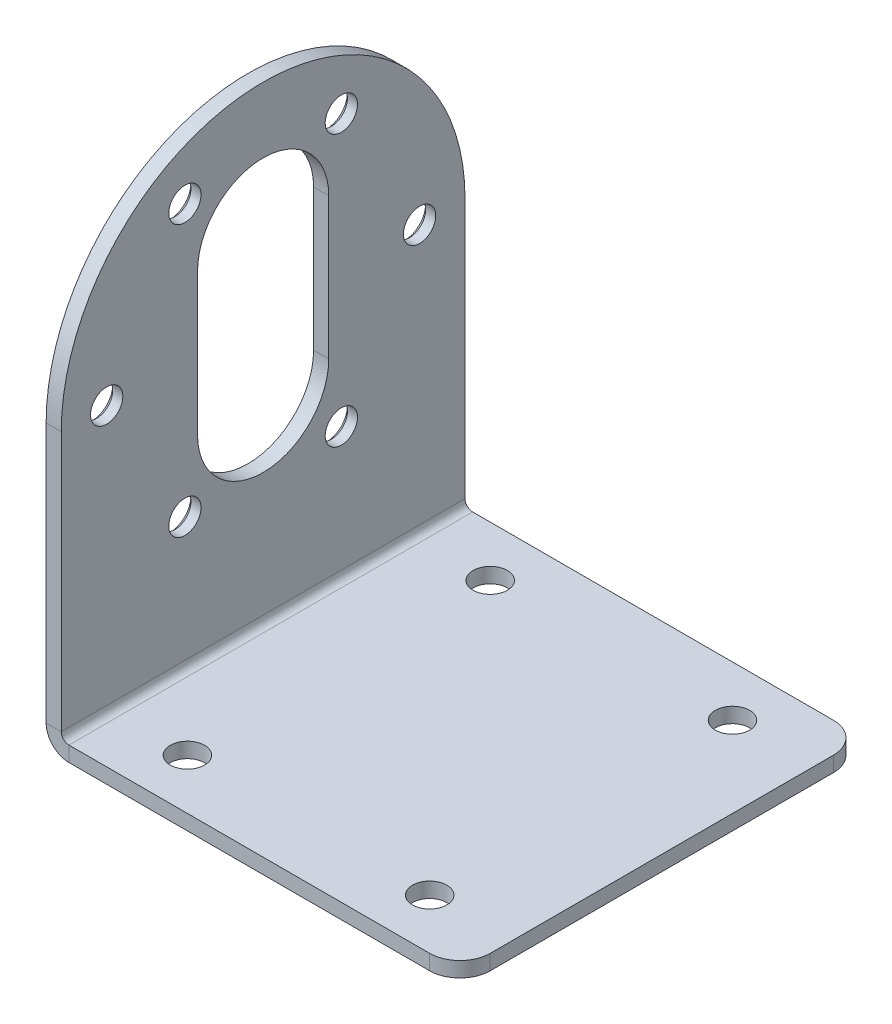
ISO-10303-21;
HEADER;
FILE_DESCRIPTION(('STEP AP214'),'2;1');
FILE_NAME('part.step','',(''),(''),'','','');
FILE_SCHEMA(('AUTOMOTIVE_DESIGN { 1 0 10303 214 1 1 1 1 }'));
ENDSEC;
DATA;
#1=APPLICATION_CONTEXT('core data for automotive mechanical design processes');
#2=APPLICATION_PROTOCOL_DEFINITION('international standard','automotive_design',2000,#1);
#3=PRODUCT_CONTEXT('',#1,'mechanical');
#4=PRODUCT('Part','Part','',(#3));
#5=PRODUCT_RELATED_PRODUCT_CATEGORY('part','',(#4));
#6=PRODUCT_DEFINITION_FORMATION('','',#4);
#7=PRODUCT_DEFINITION_CONTEXT('part definition',#1,'design');
#8=PRODUCT_DEFINITION('design','',#6,#7);
#9=PRODUCT_DEFINITION_SHAPE('','',#8);
#10=(LENGTH_UNIT() NAMED_UNIT(*) SI_UNIT(.MILLI.,.METRE.));
#11=(NAMED_UNIT(*) PLANE_ANGLE_UNIT() SI_UNIT($,.RADIAN.));
#12=(NAMED_UNIT(*) SI_UNIT($,.STERADIAN.) SOLID_ANGLE_UNIT());
#13=UNCERTAINTY_MEASURE_WITH_UNIT(LENGTH_MEASURE(1.E-05),#10,'distance_accuracy_value','');
#14=(GEOMETRIC_REPRESENTATION_CONTEXT(3) GLOBAL_UNCERTAINTY_ASSIGNED_CONTEXT((#13)) GLOBAL_UNIT_ASSIGNED_CONTEXT((#10,
#11,#12)) REPRESENTATION_CONTEXT('',''));
#15=CARTESIAN_POINT('',(0.,0.,0.));
#16=DIRECTION('',(0.,0.,1.));
#17=DIRECTION('',(1.,0.,0.));
#18=AXIS2_PLACEMENT_3D('',#15,#16,#17);
#19=CARTESIAN_POINT('',(0.,0.,0.));
#20=DIRECTION('',(1.,0.,0.));
#21=DIRECTION('',(0.,0.,-1.));
#22=AXIS2_PLACEMENT_3D('',#19,#20,#21);
#23=PLANE('',#22);
#24=CARTESIAN_POINT('',(0.,0.,-15.5));
#25=DIRECTION('',(1.,0.,0.));
#26=DIRECTION('',(0.,0.,-1.));
#27=AXIS2_PLACEMENT_3D('',#24,#25,#26);
#28=CIRCLE('',#27,2.1);
#29=CARTESIAN_POINT('',(0.,0.,-17.6));
#30=VERTEX_POINT('',#29);
#31=EDGE_CURVE('E311',#30,#30,#28,.T.);
#32=ORIENTED_EDGE('',*,*,#31,.T.);
#33=EDGE_LOOP('',(#32));
#34=FACE_BOUND('',#33,.T.);
#35=CARTESIAN_POINT('',(0.,-13.4233937586587,-7.75000000000016));
#36=DIRECTION('',(1.,0.,0.));
#37=DIRECTION('',(0.,0.,-1.));
#38=AXIS2_PLACEMENT_3D('',#35,#36,#37);
#39=CIRCLE('',#38,2.1);
#40=CARTESIAN_POINT('',(0.,-13.4233937586587,-9.85000000000015));
#41=VERTEX_POINT('',#40);
#42=EDGE_CURVE('E308',#41,#41,#39,.T.);
#43=ORIENTED_EDGE('',*,*,#42,.T.);
#44=EDGE_LOOP('',(#43));
#45=FACE_BOUND('',#44,.T.);
#46=CARTESIAN_POINT('',(0.,-13.4233937586589,7.74999999999988));
#47=DIRECTION('',(1.,0.,0.));
#48=DIRECTION('',(0.,0.,-1.));
#49=AXIS2_PLACEMENT_3D('',#46,#47,#48);
#50=CIRCLE('',#49,2.1);
#51=CARTESIAN_POINT('',(0.,-13.4233937586589,5.64999999999988));
#52=VERTEX_POINT('',#51);
#53=EDGE_CURVE('E305',#52,#52,#50,.T.);
#54=ORIENTED_EDGE('',*,*,#53,.T.);
#55=EDGE_LOOP('',(#54));
#56=FACE_BOUND('',#55,.T.);
#57=CARTESIAN_POINT('',(0.,0.,15.5));
#58=DIRECTION('',(1.,0.,0.));
#59=DIRECTION('',(0.,0.,-1.));
#60=AXIS2_PLACEMENT_3D('',#57,#58,#59);
#61=CIRCLE('',#60,2.1);
#62=CARTESIAN_POINT('',(0.,0.,13.4));
#63=VERTEX_POINT('',#62);
#64=EDGE_CURVE('E302',#63,#63,#61,.T.);
#65=ORIENTED_EDGE('',*,*,#64,.T.);
#66=EDGE_LOOP('',(#65));
#67=FACE_BOUND('',#66,.T.);
#68=CARTESIAN_POINT('',(0.,13.4233937586588,7.75000000000006));
#69=DIRECTION('',(1.,0.,0.));
#70=DIRECTION('',(0.,0.,-1.));
#71=AXIS2_PLACEMENT_3D('',#68,#69,#70);
#72=CIRCLE('',#71,2.1);
#73=CARTESIAN_POINT('',(0.,13.4233937586588,5.65000000000006));
#74=VERTEX_POINT('',#73);
#75=EDGE_CURVE('E299',#74,#74,#72,.T.);
#76=ORIENTED_EDGE('',*,*,#75,.T.);
#77=EDGE_LOOP('',(#76));
#78=FACE_BOUND('',#77,.T.);
#79=CARTESIAN_POINT('',(0.,13.4233937586588,-7.74999999999997));
#80=DIRECTION('',(1.,0.,0.));
#81=DIRECTION('',(0.,0.,-1.));
#82=AXIS2_PLACEMENT_3D('',#79,#80,#81);
#83=CIRCLE('',#82,2.1);
#84=CARTESIAN_POINT('',(0.,13.4233937586588,-9.84999999999997));
#85=VERTEX_POINT('',#84);
#86=EDGE_CURVE('E293',#85,#85,#83,.T.);
#87=ORIENTED_EDGE('',*,*,#86,.T.);
#88=EDGE_LOOP('',(#87));
#89=FACE_BOUND('',#88,.T.);
#90=DIRECTION('',(0.,-1.,0.));
#91=VECTOR('',#90,1.);
#92=CARTESIAN_POINT('',(0.,7.,-6.5));
#93=LINE('',#92,#91);
#94=CARTESIAN_POINT('',(0.,7.,-6.5));
#95=VERTEX_POINT('',#94);
#96=CARTESIAN_POINT('',(0.,-7.,-6.5));
#97=VERTEX_POINT('',#96);
#98=EDGE_CURVE('E162',#95,#97,#93,.T.);
#99=ORIENTED_EDGE('',*,*,#98,.F.);
#100=CARTESIAN_POINT('',(0.,7.,0.));
#101=DIRECTION('',(-1.,0.,0.));
#102=DIRECTION('',(0.,0.,1.));
#103=AXIS2_PLACEMENT_3D('',#100,#101,#102);
#104=CIRCLE('',#103,6.5);
#105=CARTESIAN_POINT('',(0.,7.,6.5));
#106=VERTEX_POINT('',#105);
#107=EDGE_CURVE('E167',#106,#95,#104,.T.);
#108=ORIENTED_EDGE('',*,*,#107,.F.);
#109=DIRECTION('',(0.,1.,0.));
#110=VECTOR('',#109,1.);
#111=CARTESIAN_POINT('',(0.,7.,6.5));
#112=LINE('',#111,#110);
#113=CARTESIAN_POINT('',(0.,-7.,6.5));
#114=VERTEX_POINT('',#113);
#115=EDGE_CURVE('E171',#114,#106,#112,.T.);
#116=ORIENTED_EDGE('',*,*,#115,.F.);
#117=CARTESIAN_POINT('',(0.,-7.,0.));
#118=DIRECTION('',(-1.,0.,0.));
#119=DIRECTION('',(0.,0.,1.));
#120=AXIS2_PLACEMENT_3D('',#117,#118,#119);
#121=CIRCLE('',#120,6.5);
#122=EDGE_CURVE('E151',#97,#114,#121,.T.);
#123=ORIENTED_EDGE('',*,*,#122,.F.);
#124=EDGE_LOOP('',(#99,#108,#116,#123));
#125=FACE_BOUND('',#124,.T.);
#126=DIRECTION('',(0.,1.,0.));
#127=VECTOR('',#126,1.);
#128=CARTESIAN_POINT('',(0.,0.,-20.));
#129=LINE('',#128,#127);
#130=CARTESIAN_POINT('',(0.,-25.738,-20.));
#131=VERTEX_POINT('',#130);
#132=CARTESIAN_POINT('',(0.,0.,-20.));
#133=VERTEX_POINT('',#132);
#134=EDGE_CURVE('E211',#131,#133,#129,.T.);
#135=ORIENTED_EDGE('',*,*,#134,.F.);
#136=DIRECTION('',(0.,0.,-1.));
#137=VECTOR('',#136,1.);
#138=CARTESIAN_POINT('',(0.,-25.738,0.));
#139=LINE('',#138,#137);
#140=CARTESIAN_POINT('',(0.,-25.738,20.));
#141=VERTEX_POINT('',#140);
#142=EDGE_CURVE('E217',#131,#141,#139,.F.);
#143=ORIENTED_EDGE('',*,*,#142,.T.);
#144=DIRECTION('',(0.,-1.,0.));
#145=VECTOR('',#144,1.);
#146=CARTESIAN_POINT('',(0.,0.,20.));
#147=LINE('',#146,#145);
#148=CARTESIAN_POINT('',(0.,0.,20.));
#149=VERTEX_POINT('',#148);
#150=EDGE_CURVE('E205',#149,#141,#147,.T.);
#151=ORIENTED_EDGE('',*,*,#150,.F.);
#152=CARTESIAN_POINT('',(0.,0.,0.));
#153=DIRECTION('',(1.,0.,0.));
#154=DIRECTION('',(0.,0.,-1.));
#155=AXIS2_PLACEMENT_3D('',#152,#153,#154);
#156=CIRCLE('',#155,20.);
#157=EDGE_CURVE('E208',#133,#149,#156,.T.);
#158=ORIENTED_EDGE('',*,*,#157,.F.);
#159=EDGE_LOOP('',(#135,#143,#151,#158));
#160=FACE_BOUND('',#159,.T.);
#161=ADVANCED_FACE('F42',(#34,#45,#56,#67,#78,#89,#125,#160),#23,.F.);
#162=CARTESIAN_POINT('',(1.5,-28.,-20.));
#163=DIRECTION('',(0.,0.,-1.));
#164=DIRECTION('',(-1.,0.,0.));
#165=AXIS2_PLACEMENT_3D('',#162,#163,#164);
#166=PLANE('',#165);
#167=DIRECTION('',(1.,0.,0.));
#168=VECTOR('',#167,1.);
#169=CARTESIAN_POINT('',(1.5,-26.5,-20.));
#170=LINE('',#169,#168);
#171=CARTESIAN_POINT('',(38.,-26.5,-20.));
#172=VERTEX_POINT('',#171);
#173=CARTESIAN_POINT('',(2.262,-26.5,-20.));
#174=VERTEX_POINT('',#173);
#175=EDGE_CURVE('E245',#172,#174,#170,.F.);
#176=ORIENTED_EDGE('',*,*,#175,.F.);
#177=DIRECTION('',(0.,1.,0.));
#178=VECTOR('',#177,1.);
#179=CARTESIAN_POINT('',(38.,-28.,-20.));
#180=LINE('',#179,#178);
#181=CARTESIAN_POINT('',(38.,-28.,-20.));
#182=VERTEX_POINT('',#181);
#183=EDGE_CURVE('E274',#172,#182,#180,.F.);
#184=ORIENTED_EDGE('',*,*,#183,.T.);
#185=DIRECTION('',(-1.,0.,0.));
#186=VECTOR('',#185,1.);
#187=CARTESIAN_POINT('',(1.5,-28.,-20.));
#188=LINE('',#187,#186);
#189=CARTESIAN_POINT('',(2.262,-28.,-20.));
#190=VERTEX_POINT('',#189);
#191=EDGE_CURVE('E197',#182,#190,#188,.T.);
#192=ORIENTED_EDGE('',*,*,#191,.T.);
#193=DIRECTION('',(0.,-1.,0.));
#194=VECTOR('',#193,1.);
#195=CARTESIAN_POINT('',(2.262,-28.,-20.));
#196=LINE('',#195,#194);
#197=EDGE_CURVE('E261',#174,#190,#196,.T.);
#198=ORIENTED_EDGE('',*,*,#197,.F.);
#199=EDGE_LOOP('',(#176,#184,#192,#198));
#200=FACE_BOUND('',#199,.T.);
#201=ADVANCED_FACE('F340',(#200),#166,.T.);
#202=CARTESIAN_POINT('',(41.,-28.,20.));
#203=DIRECTION('',(-1.,0.,0.));
#204=DIRECTION('',(0.,0.,1.));
#205=AXIS2_PLACEMENT_3D('',#202,#203,#204);
#206=PLANE('',#205);
#207=DIRECTION('',(0.,0.,1.));
#208=VECTOR('',#207,1.);
#209=CARTESIAN_POINT('',(41.,-28.,20.));
#210=LINE('',#209,#208);
#211=CARTESIAN_POINT('',(41.,-28.,-17.));
#212=VERTEX_POINT('',#211);
#213=CARTESIAN_POINT('',(41.,-28.,17.));
#214=VERTEX_POINT('',#213);
#215=EDGE_CURVE('E199',#212,#214,#210,.T.);
#216=ORIENTED_EDGE('',*,*,#215,.F.);
#217=DIRECTION('',(0.,-1.,0.));
#218=VECTOR('',#217,1.);
#219=CARTESIAN_POINT('',(41.,-28.,-17.));
#220=LINE('',#219,#218);
#221=CARTESIAN_POINT('',(41.,-26.5,-17.));
#222=VERTEX_POINT('',#221);
#223=EDGE_CURVE('E284',#212,#222,#220,.F.);
#224=ORIENTED_EDGE('',*,*,#223,.T.);
#225=DIRECTION('',(0.,0.,1.));
#226=VECTOR('',#225,1.);
#227=CARTESIAN_POINT('',(41.,-26.5,20.));
#228=LINE('',#227,#226);
#229=CARTESIAN_POINT('',(41.,-26.5,17.));
#230=VERTEX_POINT('',#229);
#231=EDGE_CURVE('E247',#222,#230,#228,.T.);
#232=ORIENTED_EDGE('',*,*,#231,.T.);
#233=DIRECTION('',(0.,1.,0.));
#234=VECTOR('',#233,1.);
#235=CARTESIAN_POINT('',(41.,-28.,17.));
#236=LINE('',#235,#234);
#237=EDGE_CURVE('E281',#230,#214,#236,.F.);
#238=ORIENTED_EDGE('',*,*,#237,.T.);
#239=EDGE_LOOP('',(#216,#224,#232,#238));
#240=FACE_BOUND('',#239,.T.);
#241=ADVANCED_FACE('F346',(#240),#206,.F.);
#242=CARTESIAN_POINT('',(1.5,-28.,20.));
#243=DIRECTION('',(0.,0.,-1.));
#244=DIRECTION('',(-1.,0.,0.));
#245=AXIS2_PLACEMENT_3D('',#242,#243,#244);
#246=PLANE('',#245);
#247=DIRECTION('',(-1.,0.,0.));
#248=VECTOR('',#247,1.);
#249=CARTESIAN_POINT('',(1.5,-28.,20.));
#250=LINE('',#249,#248);
#251=CARTESIAN_POINT('',(38.,-28.,20.));
#252=VERTEX_POINT('',#251);
#253=CARTESIAN_POINT('',(2.262,-28.,20.));
#254=VERTEX_POINT('',#253);
#255=EDGE_CURVE('E203',#252,#254,#250,.T.);
#256=ORIENTED_EDGE('',*,*,#255,.F.);
#257=DIRECTION('',(0.,1.,0.));
#258=VECTOR('',#257,1.);
#259=CARTESIAN_POINT('',(38.,-28.,20.));
#260=LINE('',#259,#258);
#261=CARTESIAN_POINT('',(38.,-26.5,20.));
#262=VERTEX_POINT('',#261);
#263=EDGE_CURVE('E58',#252,#262,#260,.T.);
#264=ORIENTED_EDGE('',*,*,#263,.T.);
#265=DIRECTION('',(1.,0.,0.));
#266=VECTOR('',#265,1.);
#267=CARTESIAN_POINT('',(1.5,-26.5,20.));
#268=LINE('',#267,#266);
#269=CARTESIAN_POINT('',(2.262,-26.5,20.));
#270=VERTEX_POINT('',#269);
#271=EDGE_CURVE('E241',#262,#270,#268,.F.);
#272=ORIENTED_EDGE('',*,*,#271,.T.);
#273=DIRECTION('',(0.,-1.,0.));
#274=VECTOR('',#273,1.);
#275=CARTESIAN_POINT('',(2.262,-28.,20.));
#276=LINE('',#275,#274);
#277=EDGE_CURVE('E258',#270,#254,#276,.T.);
#278=ORIENTED_EDGE('',*,*,#277,.T.);
#279=EDGE_LOOP('',(#256,#264,#272,#278));
#280=FACE_BOUND('',#279,.T.);
#281=ADVANCED_FACE('F387',(#280),#246,.F.);
#282=CARTESIAN_POINT('',(2.262,-25.738,20.));
#283=DIRECTION('',(0.,0.,1.));
#284=DIRECTION('',(0.,-1.,0.));
#285=AXIS2_PLACEMENT_3D('',#282,#283,#284);
#286=PLANE('',#285);
#287=ORIENTED_EDGE('',*,*,#277,.F.);
#288=CARTESIAN_POINT('',(2.262,-25.738,20.));
#289=DIRECTION('',(0.,0.,-1.));
#290=DIRECTION('',(-1.,0.,0.));
#291=AXIS2_PLACEMENT_3D('',#288,#289,#290);
#292=CIRCLE('',#291,0.762);
#293=CARTESIAN_POINT('',(1.5,-25.738,20.));
#294=VERTEX_POINT('',#293);
#295=EDGE_CURVE('E242',#270,#294,#292,.T.);
#296=ORIENTED_EDGE('',*,*,#295,.T.);
#297=DIRECTION('',(-1.,0.,0.));
#298=VECTOR('',#297,1.);
#299=CARTESIAN_POINT('',(0.,-25.738,20.));
#300=LINE('',#299,#298);
#301=EDGE_CURVE('E256',#294,#141,#300,.T.);
#302=ORIENTED_EDGE('',*,*,#301,.T.);
#303=CARTESIAN_POINT('',(2.262,-25.738,20.));
#304=DIRECTION('',(0.,0.,-1.));
#305=DIRECTION('',(0.,1.,0.));
#306=AXIS2_PLACEMENT_3D('',#303,#304,#305);
#307=CIRCLE('',#306,2.262);
#308=EDGE_CURVE('E200',#254,#141,#307,.T.);
#309=ORIENTED_EDGE('',*,*,#308,.F.);
#310=EDGE_LOOP('',(#287,#296,#302,#309));
#311=FACE_BOUND('',#310,.T.);
#312=ADVANCED_FACE('F383',(#311),#286,.T.);
#313=CARTESIAN_POINT('',(0.,0.,20.));
#314=DIRECTION('',(0.,0.,1.));
#315=DIRECTION('',(0.,-1.,0.));
#316=AXIS2_PLACEMENT_3D('',#313,#314,#315);
#317=PLANE('',#316);
#318=ORIENTED_EDGE('',*,*,#301,.F.);
#319=DIRECTION('',(0.,1.,0.));
#320=VECTOR('',#319,1.);
#321=CARTESIAN_POINT('',(1.5,0.,20.));
#322=LINE('',#321,#320);
#323=CARTESIAN_POINT('',(1.5,0.,20.));
#324=VERTEX_POINT('',#323);
#325=EDGE_CURVE('E238',#324,#294,#322,.F.);
#326=ORIENTED_EDGE('',*,*,#325,.F.);
#327=DIRECTION('',(-1.,0.,0.));
#328=VECTOR('',#327,1.);
#329=CARTESIAN_POINT('',(0.,0.,20.));
#330=LINE('',#329,#328);
#331=EDGE_CURVE('E254',#324,#149,#330,.T.);
#332=ORIENTED_EDGE('',*,*,#331,.T.);
#333=ORIENTED_EDGE('',*,*,#150,.T.);
#334=EDGE_LOOP('',(#318,#326,#332,#333));
#335=FACE_BOUND('',#334,.T.);
#336=ADVANCED_FACE('F379',(#335),#317,.T.);
#337=CARTESIAN_POINT('',(0.,0.,0.));
#338=DIRECTION('',(1.,0.,0.));
#339=DIRECTION('',(0.,0.,-1.));
#340=AXIS2_PLACEMENT_3D('',#337,#338,#339);
#341=CYLINDRICAL_SURFACE('',#340,20.);
#342=ORIENTED_EDGE('',*,*,#331,.F.);
#343=CARTESIAN_POINT('',(1.5,0.,0.));
#344=DIRECTION('',(1.,0.,0.));
#345=DIRECTION('',(0.,0.,-1.));
#346=AXIS2_PLACEMENT_3D('',#343,#344,#345);
#347=CIRCLE('',#346,20.);
#348=CARTESIAN_POINT('',(1.5,0.,-20.));
#349=VERTEX_POINT('',#348);
#350=EDGE_CURVE('E235',#349,#324,#347,.T.);
#351=ORIENTED_EDGE('',*,*,#350,.F.);
#352=DIRECTION('',(-1.,0.,0.));
#353=VECTOR('',#352,1.);
#354=CARTESIAN_POINT('',(0.,0.,-20.));
#355=LINE('',#354,#353);
#356=EDGE_CURVE('E252',#349,#133,#355,.T.);
#357=ORIENTED_EDGE('',*,*,#356,.T.);
#358=ORIENTED_EDGE('',*,*,#157,.T.);
#359=EDGE_LOOP('',(#342,#351,#357,#358));
#360=FACE_BOUND('',#359,.T.);
#361=ADVANCED_FACE('F375',(#360),#341,.T.);
#362=CARTESIAN_POINT('',(0.,0.,-20.));
#363=DIRECTION('',(0.,0.,-1.));
#364=DIRECTION('',(0.,1.,0.));
#365=AXIS2_PLACEMENT_3D('',#362,#363,#364);
#366=PLANE('',#365);
#367=ORIENTED_EDGE('',*,*,#356,.F.);
#368=DIRECTION('',(0.,1.,0.));
#369=VECTOR('',#368,1.);
#370=CARTESIAN_POINT('',(1.5,0.,-20.));
#371=LINE('',#370,#369);
#372=CARTESIAN_POINT('',(1.5,-25.738,-20.));
#373=VERTEX_POINT('',#372);
#374=EDGE_CURVE('E232',#373,#349,#371,.T.);
#375=ORIENTED_EDGE('',*,*,#374,.F.);
#376=DIRECTION('',(-1.,0.,0.));
#377=VECTOR('',#376,1.);
#378=CARTESIAN_POINT('',(0.,-25.738,-20.));
#379=LINE('',#378,#377);
#380=EDGE_CURVE('E220',#373,#131,#379,.T.);
#381=ORIENTED_EDGE('',*,*,#380,.T.);
#382=ORIENTED_EDGE('',*,*,#134,.T.);
#383=EDGE_LOOP('',(#367,#375,#381,#382));
#384=FACE_BOUND('',#383,.T.);
#385=ADVANCED_FACE('F371',(#384),#366,.T.);
#386=CARTESIAN_POINT('',(2.262,-25.738,-20.));
#387=DIRECTION('',(0.,0.,1.));
#388=DIRECTION('',(0.,-1.,0.));
#389=AXIS2_PLACEMENT_3D('',#386,#387,#388);
#390=PLANE('',#389);
#391=CARTESIAN_POINT('',(2.262,-25.738,-20.));
#392=DIRECTION('',(0.,0.,-1.));
#393=DIRECTION('',(-1.,0.,0.));
#394=AXIS2_PLACEMENT_3D('',#391,#392,#393);
#395=CIRCLE('',#394,0.762);
#396=EDGE_CURVE('E196',#373,#174,#395,.F.);
#397=ORIENTED_EDGE('',*,*,#396,.T.);
#398=ORIENTED_EDGE('',*,*,#197,.T.);
#399=CARTESIAN_POINT('',(2.262,-25.738,-20.));
#400=DIRECTION('',(0.,0.,-1.));
#401=DIRECTION('',(0.,1.,0.));
#402=AXIS2_PLACEMENT_3D('',#399,#400,#401);
#403=CIRCLE('',#402,2.262);
#404=EDGE_CURVE('E221',#131,#190,#403,.F.);
#405=ORIENTED_EDGE('',*,*,#404,.F.);
#406=ORIENTED_EDGE('',*,*,#380,.F.);
#407=EDGE_LOOP('',(#397,#398,#405,#406));
#408=FACE_BOUND('',#407,.T.);
#409=ADVANCED_FACE('F374',(#408),#390,.F.);
#410=CARTESIAN_POINT('',(1.5,-28.,20.));
#411=DIRECTION('',(0.,1.,0.));
#412=DIRECTION('',(0.,0.,1.));
#413=AXIS2_PLACEMENT_3D('',#410,#411,#412);
#414=PLANE('',#413);
#415=CARTESIAN_POINT('',(9.00000000000001,-28.,-15.));
#416=DIRECTION('',(0.,1.,0.));
#417=DIRECTION('',(0.,0.,1.));
#418=AXIS2_PLACEMENT_3D('',#415,#416,#417);
#419=CIRCLE('',#418,1.7);
#420=CARTESIAN_POINT('',(9.00000000000001,-28.,-13.3));
#421=VERTEX_POINT('',#420);
#422=EDGE_CURVE('E488',#421,#421,#419,.T.);
#423=ORIENTED_EDGE('',*,*,#422,.T.);
#424=EDGE_LOOP('',(#423));
#425=FACE_BOUND('',#424,.T.);
#426=CARTESIAN_POINT('',(9.00000000000001,-28.,15.));
#427=DIRECTION('',(0.,1.,0.));
#428=DIRECTION('',(0.,0.,1.));
#429=AXIS2_PLACEMENT_3D('',#426,#427,#428);
#430=CIRCLE('',#429,1.7);
#431=CARTESIAN_POINT('',(9.00000000000001,-28.,16.7));
#432=VERTEX_POINT('',#431);
#433=EDGE_CURVE('E492',#432,#432,#430,.T.);
#434=ORIENTED_EDGE('',*,*,#433,.T.);
#435=EDGE_LOOP('',(#434));
#436=FACE_BOUND('',#435,.T.);
#437=CARTESIAN_POINT('',(33.,-28.,15.));
#438=DIRECTION('',(0.,1.,0.));
#439=DIRECTION('',(0.,0.,1.));
#440=AXIS2_PLACEMENT_3D('',#437,#438,#439);
#441=CIRCLE('',#440,1.7);
#442=CARTESIAN_POINT('',(33.,-28.,16.7));
#443=VERTEX_POINT('',#442);
#444=EDGE_CURVE('E496',#443,#443,#441,.T.);
#445=ORIENTED_EDGE('',*,*,#444,.T.);
#446=EDGE_LOOP('',(#445));
#447=FACE_BOUND('',#446,.T.);
#448=CARTESIAN_POINT('',(33.,-28.,-15.));
#449=DIRECTION('',(0.,1.,0.));
#450=DIRECTION('',(0.,0.,1.));
#451=AXIS2_PLACEMENT_3D('',#448,#449,#450);
#452=CIRCLE('',#451,1.7);
#453=CARTESIAN_POINT('',(33.,-28.,-13.3));
#454=VERTEX_POINT('',#453);
#455=EDGE_CURVE('E499',#454,#454,#452,.T.);
#456=ORIENTED_EDGE('',*,*,#455,.T.);
#457=EDGE_LOOP('',(#456));
#458=FACE_BOUND('',#457,.T.);
#459=ORIENTED_EDGE('',*,*,#191,.F.);
#460=CARTESIAN_POINT('',(38.,-28.,-17.));
#461=DIRECTION('',(0.,1.,0.));
#462=DIRECTION('',(0.,0.,1.));
#463=AXIS2_PLACEMENT_3D('',#460,#461,#462);
#464=CIRCLE('',#463,3.);
#465=EDGE_CURVE('E279',#182,#212,#464,.F.);
#466=ORIENTED_EDGE('',*,*,#465,.T.);
#467=ORIENTED_EDGE('',*,*,#215,.T.);
#468=CARTESIAN_POINT('',(38.,-28.,17.));
#469=DIRECTION('',(0.,1.,0.));
#470=DIRECTION('',(0.,0.,1.));
#471=AXIS2_PLACEMENT_3D('',#468,#469,#470);
#472=CIRCLE('',#471,3.);
#473=EDGE_CURVE('E277',#214,#252,#472,.F.);
#474=ORIENTED_EDGE('',*,*,#473,.T.);
#475=ORIENTED_EDGE('',*,*,#255,.T.);
#476=DIRECTION('',(0.,0.,-1.));
#477=VECTOR('',#476,1.);
#478=CARTESIAN_POINT('',(2.262,-28.,20.));
#479=LINE('',#478,#477);
#480=EDGE_CURVE('E214',#254,#190,#479,.T.);
#481=ORIENTED_EDGE('',*,*,#480,.T.);
#482=EDGE_LOOP('',(#459,#466,#467,#474,#475,#481));
#483=FACE_BOUND('',#482,.T.);
#484=ADVANCED_FACE('F352',(#425,#436,#447,#458,#483),#414,.F.);
#485=CARTESIAN_POINT('',(2.262,-25.738,20.));
#486=DIRECTION('',(0.,0.,-1.));
#487=DIRECTION('',(-1.,0.,0.));
#488=AXIS2_PLACEMENT_3D('',#485,#486,#487);
#489=CYLINDRICAL_SURFACE('',#488,2.262);
#490=ORIENTED_EDGE('',*,*,#308,.T.);
#491=ORIENTED_EDGE('',*,*,#142,.F.);
#492=ORIENTED_EDGE('',*,*,#404,.T.);
#493=ORIENTED_EDGE('',*,*,#480,.F.);
#494=EDGE_LOOP('',(#490,#491,#492,#493));
#495=FACE_BOUND('',#494,.T.);
#496=ADVANCED_FACE('F354',(#495),#489,.T.);
#497=CARTESIAN_POINT('',(1.5,0.,0.));
#498=DIRECTION('',(1.,0.,0.));
#499=DIRECTION('',(0.,0.,-1.));
#500=AXIS2_PLACEMENT_3D('',#497,#498,#499);
#501=PLANE('',#500);
#502=CARTESIAN_POINT('',(1.5,7.,0.));
#503=DIRECTION('',(1.,0.,0.));
#504=DIRECTION('',(0.,0.,-1.));
#505=AXIS2_PLACEMENT_3D('',#502,#503,#504);
#506=CIRCLE('',#505,6.5);
#507=CARTESIAN_POINT('',(1.50000000000002,7.,-6.5));
#508=VERTEX_POINT('',#507);
#509=CARTESIAN_POINT('',(1.50000000000002,7.,6.5));
#510=VERTEX_POINT('',#509);
#511=EDGE_CURVE('E272',#508,#510,#506,.T.);
#512=ORIENTED_EDGE('',*,*,#511,.F.);
#513=DIRECTION('',(0.,1.,0.));
#514=VECTOR('',#513,1.);
#515=CARTESIAN_POINT('',(1.5,0.,-6.5));
#516=LINE('',#515,#514);
#517=CARTESIAN_POINT('',(1.5,-7.,-6.5));
#518=VERTEX_POINT('',#517);
#519=EDGE_CURVE('E264',#518,#508,#516,.T.);
#520=ORIENTED_EDGE('',*,*,#519,.F.);
#521=CARTESIAN_POINT('',(1.5,-7.,0.));
#522=DIRECTION('',(1.,0.,0.));
#523=DIRECTION('',(0.,0.,-1.));
#524=AXIS2_PLACEMENT_3D('',#521,#522,#523);
#525=CIRCLE('',#524,6.5);
#526=CARTESIAN_POINT('',(1.50000000000002,-7.,6.5));
#527=VERTEX_POINT('',#526);
#528=EDGE_CURVE('E154',#527,#518,#525,.T.);
#529=ORIENTED_EDGE('',*,*,#528,.F.);
#530=DIRECTION('',(0.,-1.,0.));
#531=VECTOR('',#530,1.);
#532=CARTESIAN_POINT('',(1.5,0.,6.5));
#533=LINE('',#532,#531);
#534=EDGE_CURVE('E270',#510,#527,#533,.T.);
#535=ORIENTED_EDGE('',*,*,#534,.F.);
#536=EDGE_LOOP('',(#512,#520,#529,#535));
#537=FACE_BOUND('',#536,.T.);
#538=CARTESIAN_POINT('',(1.5,-13.4233937586587,-7.75000000000016));
#539=DIRECTION('',(1.,0.,0.));
#540=DIRECTION('',(0.,0.,-1.));
#541=AXIS2_PLACEMENT_3D('',#538,#539,#540);
#542=CIRCLE('',#541,1.59999999999999);
#543=CARTESIAN_POINT('',(1.5,-13.4233937586587,-9.35000000000015));
#544=VERTEX_POINT('',#543);
#545=EDGE_CURVE('E178',#544,#544,#542,.T.);
#546=ORIENTED_EDGE('',*,*,#545,.F.);
#547=EDGE_LOOP('',(#546));
#548=FACE_BOUND('',#547,.T.);
#549=CARTESIAN_POINT('',(1.5,-13.4233937586589,7.74999999999988));
#550=DIRECTION('',(1.,0.,0.));
#551=DIRECTION('',(0.,0.,-1.));
#552=AXIS2_PLACEMENT_3D('',#549,#550,#551);
#553=CIRCLE('',#552,1.59999999999999);
#554=CARTESIAN_POINT('',(1.5,-13.4233937586589,6.14999999999988));
#555=VERTEX_POINT('',#554);
#556=EDGE_CURVE('E183',#555,#555,#553,.T.);
#557=ORIENTED_EDGE('',*,*,#556,.F.);
#558=EDGE_LOOP('',(#557));
#559=FACE_BOUND('',#558,.T.);
#560=CARTESIAN_POINT('',(1.5,0.,15.5));
#561=DIRECTION('',(1.,0.,0.));
#562=DIRECTION('',(0.,0.,-1.));
#563=AXIS2_PLACEMENT_3D('',#560,#561,#562);
#564=CIRCLE('',#563,1.59999999999999);
#565=CARTESIAN_POINT('',(1.5,0.,13.9));
#566=VERTEX_POINT('',#565);
#567=EDGE_CURVE('E186',#566,#566,#564,.T.);
#568=ORIENTED_EDGE('',*,*,#567,.F.);
#569=EDGE_LOOP('',(#568));
#570=FACE_BOUND('',#569,.T.);
#571=CARTESIAN_POINT('',(1.5,13.4233937586588,7.75000000000006));
#572=DIRECTION('',(1.,0.,0.));
#573=DIRECTION('',(0.,0.,-1.));
#574=AXIS2_PLACEMENT_3D('',#571,#572,#573);
#575=CIRCLE('',#574,1.59999999999999);
#576=CARTESIAN_POINT('',(1.5,13.4233937586588,6.15000000000007));
#577=VERTEX_POINT('',#576);
#578=EDGE_CURVE('E189',#577,#577,#575,.T.);
#579=ORIENTED_EDGE('',*,*,#578,.F.);
#580=EDGE_LOOP('',(#579));
#581=FACE_BOUND('',#580,.T.);
#582=CARTESIAN_POINT('',(1.5,13.4233937586588,-7.74999999999997));
#583=DIRECTION('',(1.,0.,0.));
#584=DIRECTION('',(0.,0.,-1.));
#585=AXIS2_PLACEMENT_3D('',#582,#583,#584);
#586=CIRCLE('',#585,1.59999999999999);
#587=CARTESIAN_POINT('',(1.5,13.4233937586588,-9.34999999999996));
#588=VERTEX_POINT('',#587);
#589=EDGE_CURVE('E192',#588,#588,#586,.T.);
#590=ORIENTED_EDGE('',*,*,#589,.F.);
#591=EDGE_LOOP('',(#590));
#592=FACE_BOUND('',#591,.T.);
#593=CARTESIAN_POINT('',(1.5,0.,-15.5));
#594=DIRECTION('',(1.,0.,0.));
#595=DIRECTION('',(0.,0.,-1.));
#596=AXIS2_PLACEMENT_3D('',#593,#594,#595);
#597=CIRCLE('',#596,1.59999999999999);
#598=CARTESIAN_POINT('',(1.5,0.,-17.1));
#599=VERTEX_POINT('',#598);
#600=EDGE_CURVE('E193',#599,#599,#597,.T.);
#601=ORIENTED_EDGE('',*,*,#600,.F.);
#602=EDGE_LOOP('',(#601));
#603=FACE_BOUND('',#602,.T.);
#604=ORIENTED_EDGE('',*,*,#374,.T.);
#605=ORIENTED_EDGE('',*,*,#350,.T.);
#606=ORIENTED_EDGE('',*,*,#325,.T.);
#607=DIRECTION('',(0.,0.,-1.));
#608=VECTOR('',#607,1.);
#609=CARTESIAN_POINT('',(1.5,-25.738,0.));
#610=LINE('',#609,#608);
#611=EDGE_CURVE('E224',#373,#294,#610,.F.);
#612=ORIENTED_EDGE('',*,*,#611,.F.);
#613=EDGE_LOOP('',(#604,#605,#606,#612));
#614=FACE_BOUND('',#613,.T.);
#615=ADVANCED_FACE('F357',(#537,#548,#559,#570,#581,#592,#603,#614),#501,.T.);
#616=CARTESIAN_POINT('',(1.5,-26.5,20.));
#617=DIRECTION('',(0.,1.,0.));
#618=DIRECTION('',(0.,0.,1.));
#619=AXIS2_PLACEMENT_3D('',#616,#617,#618);
#620=PLANE('',#619);
#621=CARTESIAN_POINT('',(9.00000000000001,-26.5,-15.));
#622=DIRECTION('',(0.,1.,0.));
#623=DIRECTION('',(0.,0.,1.));
#624=AXIS2_PLACEMENT_3D('',#621,#622,#623);
#625=CIRCLE('',#624,1.7);
#626=CARTESIAN_POINT('',(9.00000000000001,-26.5,-13.3));
#627=VERTEX_POINT('',#626);
#628=EDGE_CURVE('E514',#627,#627,#625,.T.);
#629=ORIENTED_EDGE('',*,*,#628,.F.);
#630=EDGE_LOOP('',(#629));
#631=FACE_BOUND('',#630,.T.);
#632=CARTESIAN_POINT('',(9.00000000000001,-26.5,15.));
#633=DIRECTION('',(0.,1.,0.));
#634=DIRECTION('',(0.,0.,1.));
#635=AXIS2_PLACEMENT_3D('',#632,#633,#634);
#636=CIRCLE('',#635,1.7);
#637=CARTESIAN_POINT('',(9.00000000000001,-26.5,16.7));
#638=VERTEX_POINT('',#637);
#639=EDGE_CURVE('E510',#638,#638,#636,.T.);
#640=ORIENTED_EDGE('',*,*,#639,.F.);
#641=EDGE_LOOP('',(#640));
#642=FACE_BOUND('',#641,.T.);
#643=CARTESIAN_POINT('',(33.,-26.5,15.));
#644=DIRECTION('',(0.,1.,0.));
#645=DIRECTION('',(0.,0.,1.));
#646=AXIS2_PLACEMENT_3D('',#643,#644,#645);
#647=CIRCLE('',#646,1.7);
#648=CARTESIAN_POINT('',(33.,-26.5,16.7));
#649=VERTEX_POINT('',#648);
#650=EDGE_CURVE('E507',#649,#649,#647,.T.);
#651=ORIENTED_EDGE('',*,*,#650,.F.);
#652=EDGE_LOOP('',(#651));
#653=FACE_BOUND('',#652,.T.);
#654=CARTESIAN_POINT('',(33.,-26.5,-15.));
#655=DIRECTION('',(0.,1.,0.));
#656=DIRECTION('',(0.,0.,1.));
#657=AXIS2_PLACEMENT_3D('',#654,#655,#656);
#658=CIRCLE('',#657,1.7);
#659=CARTESIAN_POINT('',(33.,-26.5,-13.3));
#660=VERTEX_POINT('',#659);
#661=EDGE_CURVE('E501',#660,#660,#658,.T.);
#662=ORIENTED_EDGE('',*,*,#661,.F.);
#663=EDGE_LOOP('',(#662));
#664=FACE_BOUND('',#663,.T.);
#665=ORIENTED_EDGE('',*,*,#231,.F.);
#666=CARTESIAN_POINT('',(38.,-26.5,-17.));
#667=DIRECTION('',(0.,1.,0.));
#668=DIRECTION('',(0.,0.,1.));
#669=AXIS2_PLACEMENT_3D('',#666,#667,#668);
#670=CIRCLE('',#669,3.);
#671=EDGE_CURVE('E287',#222,#172,#670,.T.);
#672=ORIENTED_EDGE('',*,*,#671,.T.);
#673=ORIENTED_EDGE('',*,*,#175,.T.);
#674=DIRECTION('',(0.,0.,1.));
#675=VECTOR('',#674,1.);
#676=CARTESIAN_POINT('',(2.262,-26.5,20.));
#677=LINE('',#676,#675);
#678=EDGE_CURVE('E229',#270,#174,#677,.F.);
#679=ORIENTED_EDGE('',*,*,#678,.F.);
#680=ORIENTED_EDGE('',*,*,#271,.F.);
#681=CARTESIAN_POINT('',(38.,-26.5,17.));
#682=DIRECTION('',(0.,1.,0.));
#683=DIRECTION('',(0.,0.,1.));
#684=AXIS2_PLACEMENT_3D('',#681,#682,#683);
#685=CIRCLE('',#684,3.);
#686=EDGE_CURVE('E65',#262,#230,#685,.T.);
#687=ORIENTED_EDGE('',*,*,#686,.T.);
#688=EDGE_LOOP('',(#665,#672,#673,#679,#680,#687));
#689=FACE_BOUND('',#688,.T.);
#690=ADVANCED_FACE('F361',(#631,#642,#653,#664,#689),#620,.T.);
#691=CARTESIAN_POINT('',(2.262,-25.738,20.));
#692=DIRECTION('',(0.,0.,-1.));
#693=DIRECTION('',(-1.,0.,0.));
#694=AXIS2_PLACEMENT_3D('',#691,#692,#693);
#695=CYLINDRICAL_SURFACE('',#694,0.762);
#696=ORIENTED_EDGE('',*,*,#295,.F.);
#697=ORIENTED_EDGE('',*,*,#678,.T.);
#698=ORIENTED_EDGE('',*,*,#396,.F.);
#699=ORIENTED_EDGE('',*,*,#611,.T.);
#700=EDGE_LOOP('',(#696,#697,#698,#699));
#701=FACE_BOUND('',#700,.T.);
#702=ADVANCED_FACE('F365',(#701),#695,.F.);
#703=CARTESIAN_POINT('',(0.,0.,-15.5));
#704=DIRECTION('',(-1.,0.,0.));
#705=DIRECTION('',(0.,0.,1.));
#706=AXIS2_PLACEMENT_3D('',#703,#704,#705);
#707=CYLINDRICAL_SURFACE('',#706,1.59999999999999);
#708=CARTESIAN_POINT('',(0.499999999999996,0.,-15.5));
#709=DIRECTION('',(1.,0.,0.));
#710=DIRECTION('',(0.,0.,-1.));
#711=AXIS2_PLACEMENT_3D('',#708,#709,#710);
#712=CIRCLE('',#711,1.59999999999999);
#713=CARTESIAN_POINT('',(0.499999999999996,0.,-17.1));
#714=VERTEX_POINT('',#713);
#715=EDGE_CURVE('E296',#714,#714,#712,.F.);
#716=ORIENTED_EDGE('',*,*,#715,.T.);
#717=EDGE_LOOP('',(#716));
#718=FACE_BOUND('',#717,.T.);
#719=ORIENTED_EDGE('',*,*,#600,.T.);
#720=EDGE_LOOP('',(#719));
#721=FACE_BOUND('',#720,.T.);
#722=ADVANCED_FACE('F369',(#718,#721),#707,.F.);
#723=CARTESIAN_POINT('',(0.,13.4233937586588,-7.74999999999997));
#724=DIRECTION('',(-1.,0.,0.));
#725=DIRECTION('',(0.,0.,1.));
#726=AXIS2_PLACEMENT_3D('',#723,#724,#725);
#727=CYLINDRICAL_SURFACE('',#726,1.59999999999999);
#728=CARTESIAN_POINT('',(0.499999999999996,13.4233937586588,-7.74999999999997));
#729=DIRECTION('',(1.,0.,0.));
#730=DIRECTION('',(0.,0.,-1.));
#731=AXIS2_PLACEMENT_3D('',#728,#729,#730);
#732=CIRCLE('',#731,1.59999999999999);
#733=CARTESIAN_POINT('',(0.499999999999996,13.4233937586588,-9.34999999999996));
#734=VERTEX_POINT('',#733);
#735=EDGE_CURVE('E290',#734,#734,#732,.F.);
#736=ORIENTED_EDGE('',*,*,#735,.T.);
#737=EDGE_LOOP('',(#736));
#738=FACE_BOUND('',#737,.T.);
#739=ORIENTED_EDGE('',*,*,#589,.T.);
#740=EDGE_LOOP('',(#739));
#741=FACE_BOUND('',#740,.T.);
#742=ADVANCED_FACE('F557',(#738,#741),#727,.F.);
#743=CARTESIAN_POINT('',(0.,13.4233937586588,7.75000000000006));
#744=DIRECTION('',(-1.,0.,0.));
#745=DIRECTION('',(0.,0.,1.));
#746=AXIS2_PLACEMENT_3D('',#743,#744,#745);
#747=CYLINDRICAL_SURFACE('',#746,1.59999999999999);
#748=CARTESIAN_POINT('',(0.499999999999996,13.4233937586588,7.75000000000006));
#749=DIRECTION('',(1.,0.,0.));
#750=DIRECTION('',(0.,0.,-1.));
#751=AXIS2_PLACEMENT_3D('',#748,#749,#750);
#752=CIRCLE('',#751,1.59999999999999);
#753=CARTESIAN_POINT('',(0.499999999999996,13.4233937586588,6.15000000000007));
#754=VERTEX_POINT('',#753);
#755=EDGE_CURVE('E11',#754,#754,#752,.F.);
#756=ORIENTED_EDGE('',*,*,#755,.T.);
#757=EDGE_LOOP('',(#756));
#758=FACE_BOUND('',#757,.T.);
#759=ORIENTED_EDGE('',*,*,#578,.T.);
#760=EDGE_LOOP('',(#759));
#761=FACE_BOUND('',#760,.T.);
#762=ADVANCED_FACE('F554',(#758,#761),#747,.F.);
#763=CARTESIAN_POINT('',(0.,0.,15.5));
#764=DIRECTION('',(-1.,0.,0.));
#765=DIRECTION('',(0.,0.,1.));
#766=AXIS2_PLACEMENT_3D('',#763,#764,#765);
#767=CYLINDRICAL_SURFACE('',#766,1.59999999999999);
#768=CARTESIAN_POINT('',(0.499999999999996,0.,15.5));
#769=DIRECTION('',(1.,0.,0.));
#770=DIRECTION('',(0.,0.,-1.));
#771=AXIS2_PLACEMENT_3D('',#768,#769,#770);
#772=CIRCLE('',#771,1.59999999999999);
#773=CARTESIAN_POINT('',(0.499999999999996,0.,13.9));
#774=VERTEX_POINT('',#773);
#775=EDGE_CURVE('E51',#774,#774,#772,.F.);
#776=ORIENTED_EDGE('',*,*,#775,.T.);
#777=EDGE_LOOP('',(#776));
#778=FACE_BOUND('',#777,.T.);
#779=ORIENTED_EDGE('',*,*,#567,.T.);
#780=EDGE_LOOP('',(#779));
#781=FACE_BOUND('',#780,.T.);
#782=ADVANCED_FACE('F322',(#778,#781),#767,.F.);
#783=CARTESIAN_POINT('',(0.,-13.4233937586589,7.74999999999988));
#784=DIRECTION('',(-1.,0.,0.));
#785=DIRECTION('',(0.,0.,1.));
#786=AXIS2_PLACEMENT_3D('',#783,#784,#785);
#787=CYLINDRICAL_SURFACE('',#786,1.59999999999999);
#788=CARTESIAN_POINT('',(0.499999999999995,-13.4233937586589,7.74999999999988));
#789=DIRECTION('',(1.,0.,0.));
#790=DIRECTION('',(0.,0.,-1.));
#791=AXIS2_PLACEMENT_3D('',#788,#789,#790);
#792=CIRCLE('',#791,1.59999999999999);
#793=CARTESIAN_POINT('',(0.499999999999995,-13.4233937586589,6.14999999999988));
#794=VERTEX_POINT('',#793);
#795=EDGE_CURVE('E317',#794,#794,#792,.F.);
#796=ORIENTED_EDGE('',*,*,#795,.T.);
#797=EDGE_LOOP('',(#796));
#798=FACE_BOUND('',#797,.T.);
#799=ORIENTED_EDGE('',*,*,#556,.T.);
#800=EDGE_LOOP('',(#799));
#801=FACE_BOUND('',#800,.T.);
#802=ADVANCED_FACE('F442',(#798,#801),#787,.F.);
#803=CARTESIAN_POINT('',(0.,-13.4233937586587,-7.75000000000016));
#804=DIRECTION('',(-1.,0.,0.));
#805=DIRECTION('',(0.,0.,1.));
#806=AXIS2_PLACEMENT_3D('',#803,#804,#805);
#807=CYLINDRICAL_SURFACE('',#806,1.59999999999999);
#808=CARTESIAN_POINT('',(0.499999999999996,-13.4233937586587,-7.75000000000016));
#809=DIRECTION('',(1.,0.,0.));
#810=DIRECTION('',(0.,0.,-1.));
#811=AXIS2_PLACEMENT_3D('',#808,#809,#810);
#812=CIRCLE('',#811,1.59999999999999);
#813=CARTESIAN_POINT('',(0.499999999999996,-13.4233937586587,-9.35000000000015));
#814=VERTEX_POINT('',#813);
#815=EDGE_CURVE('E314',#814,#814,#812,.F.);
#816=ORIENTED_EDGE('',*,*,#815,.T.);
#817=EDGE_LOOP('',(#816));
#818=FACE_BOUND('',#817,.T.);
#819=ORIENTED_EDGE('',*,*,#545,.T.);
#820=EDGE_LOOP('',(#819));
#821=FACE_BOUND('',#820,.T.);
#822=ADVANCED_FACE('F438',(#818,#821),#807,.F.);
#823=CARTESIAN_POINT('',(41.,7.,0.));
#824=DIRECTION('',(-1.,0.,0.));
#825=DIRECTION('',(0.,0.,1.));
#826=AXIS2_PLACEMENT_3D('',#823,#824,#825);
#827=CYLINDRICAL_SURFACE('',#826,6.5);
#828=ORIENTED_EDGE('',*,*,#511,.T.);
#829=DIRECTION('',(-1.,0.,0.));
#830=VECTOR('',#829,1.);
#831=CARTESIAN_POINT('',(41.,7.,6.5));
#832=LINE('',#831,#830);
#833=EDGE_CURVE('E176',#510,#106,#832,.T.);
#834=ORIENTED_EDGE('',*,*,#833,.T.);
#835=ORIENTED_EDGE('',*,*,#107,.T.);
#836=DIRECTION('',(-1.,0.,0.));
#837=VECTOR('',#836,1.);
#838=CARTESIAN_POINT('',(41.,7.,-6.5));
#839=LINE('',#838,#837);
#840=EDGE_CURVE('E158',#508,#95,#839,.T.);
#841=ORIENTED_EDGE('',*,*,#840,.F.);
#842=EDGE_LOOP('',(#828,#834,#835,#841));
#843=FACE_BOUND('',#842,.T.);
#844=ADVANCED_FACE('F441',(#843),#827,.F.);
#845=CARTESIAN_POINT('',(41.,7.,6.5));
#846=DIRECTION('',(0.,0.,1.));
#847=DIRECTION('',(0.,-1.,0.));
#848=AXIS2_PLACEMENT_3D('',#845,#846,#847);
#849=PLANE('',#848);
#850=ORIENTED_EDGE('',*,*,#534,.T.);
#851=DIRECTION('',(-1.,0.,0.));
#852=VECTOR('',#851,1.);
#853=CARTESIAN_POINT('',(41.,-7.,6.5));
#854=LINE('',#853,#852);
#855=EDGE_CURVE('E157',#527,#114,#854,.T.);
#856=ORIENTED_EDGE('',*,*,#855,.T.);
#857=ORIENTED_EDGE('',*,*,#115,.T.);
#858=ORIENTED_EDGE('',*,*,#833,.F.);
#859=EDGE_LOOP('',(#850,#856,#857,#858));
#860=FACE_BOUND('',#859,.T.);
#861=ADVANCED_FACE('F540',(#860),#849,.F.);
#862=CARTESIAN_POINT('',(41.,-7.,0.));
#863=DIRECTION('',(-1.,0.,0.));
#864=DIRECTION('',(0.,0.,1.));
#865=AXIS2_PLACEMENT_3D('',#862,#863,#864);
#866=CYLINDRICAL_SURFACE('',#865,6.5);
#867=ORIENTED_EDGE('',*,*,#528,.T.);
#868=DIRECTION('',(-1.,0.,0.));
#869=VECTOR('',#868,1.);
#870=CARTESIAN_POINT('',(41.,-7.,-6.5));
#871=LINE('',#870,#869);
#872=EDGE_CURVE('E146',#518,#97,#871,.T.);
#873=ORIENTED_EDGE('',*,*,#872,.T.);
#874=ORIENTED_EDGE('',*,*,#122,.T.);
#875=ORIENTED_EDGE('',*,*,#855,.F.);
#876=EDGE_LOOP('',(#867,#873,#874,#875));
#877=FACE_BOUND('',#876,.T.);
#878=ADVANCED_FACE('F148',(#877),#866,.F.);
#879=CARTESIAN_POINT('',(41.,7.,-6.5));
#880=DIRECTION('',(0.,0.,-1.));
#881=DIRECTION('',(0.,1.,0.));
#882=AXIS2_PLACEMENT_3D('',#879,#880,#881);
#883=PLANE('',#882);
#884=ORIENTED_EDGE('',*,*,#519,.T.);
#885=ORIENTED_EDGE('',*,*,#840,.T.);
#886=ORIENTED_EDGE('',*,*,#98,.T.);
#887=ORIENTED_EDGE('',*,*,#872,.F.);
#888=EDGE_LOOP('',(#884,#885,#886,#887));
#889=FACE_BOUND('',#888,.T.);
#890=ADVANCED_FACE('F163',(#889),#883,.F.);
#891=CARTESIAN_POINT('',(33.,-26.5,-15.));
#892=DIRECTION('',(0.,1.,0.));
#893=DIRECTION('',(0.,0.,1.));
#894=AXIS2_PLACEMENT_3D('',#891,#892,#893);
#895=CYLINDRICAL_SURFACE('',#894,1.7);
#896=ORIENTED_EDGE('',*,*,#455,.F.);
#897=EDGE_LOOP('',(#896));
#898=FACE_BOUND('',#897,.T.);
#899=ORIENTED_EDGE('',*,*,#661,.T.);
#900=EDGE_LOOP('',(#899));
#901=FACE_BOUND('',#900,.T.);
#902=ADVANCED_FACE('F526',(#898,#901),#895,.F.);
#903=CARTESIAN_POINT('',(33.,-26.5,15.));
#904=DIRECTION('',(0.,1.,0.));
#905=DIRECTION('',(0.,0.,1.));
#906=AXIS2_PLACEMENT_3D('',#903,#904,#905);
#907=CYLINDRICAL_SURFACE('',#906,1.7);
#908=ORIENTED_EDGE('',*,*,#444,.F.);
#909=EDGE_LOOP('',(#908));
#910=FACE_BOUND('',#909,.T.);
#911=ORIENTED_EDGE('',*,*,#650,.T.);
#912=EDGE_LOOP('',(#911));
#913=FACE_BOUND('',#912,.T.);
#914=ADVANCED_FACE('F528',(#910,#913),#907,.F.);
#915=CARTESIAN_POINT('',(9.00000000000001,-26.5,15.));
#916=DIRECTION('',(0.,1.,0.));
#917=DIRECTION('',(0.,0.,1.));
#918=AXIS2_PLACEMENT_3D('',#915,#916,#917);
#919=CYLINDRICAL_SURFACE('',#918,1.7);
#920=ORIENTED_EDGE('',*,*,#433,.F.);
#921=EDGE_LOOP('',(#920));
#922=FACE_BOUND('',#921,.T.);
#923=ORIENTED_EDGE('',*,*,#639,.T.);
#924=EDGE_LOOP('',(#923));
#925=FACE_BOUND('',#924,.T.);
#926=ADVANCED_FACE('F534',(#922,#925),#919,.F.);
#927=CARTESIAN_POINT('',(9.00000000000001,-26.5,-15.));
#928=DIRECTION('',(0.,1.,0.));
#929=DIRECTION('',(0.,0.,1.));
#930=AXIS2_PLACEMENT_3D('',#927,#928,#929);
#931=CYLINDRICAL_SURFACE('',#930,1.7);
#932=ORIENTED_EDGE('',*,*,#422,.F.);
#933=EDGE_LOOP('',(#932));
#934=FACE_BOUND('',#933,.T.);
#935=ORIENTED_EDGE('',*,*,#628,.T.);
#936=EDGE_LOOP('',(#935));
#937=FACE_BOUND('',#936,.T.);
#938=ADVANCED_FACE('F401',(#934,#937),#931,.F.);
#939=CARTESIAN_POINT('',(38.,-28.,-17.));
#940=DIRECTION('',(0.,1.,0.));
#941=DIRECTION('',(0.,0.,1.));
#942=AXIS2_PLACEMENT_3D('',#939,#940,#941);
#943=CYLINDRICAL_SURFACE('',#942,3.);
#944=ORIENTED_EDGE('',*,*,#671,.F.);
#945=ORIENTED_EDGE('',*,*,#223,.F.);
#946=ORIENTED_EDGE('',*,*,#465,.F.);
#947=ORIENTED_EDGE('',*,*,#183,.F.);
#948=EDGE_LOOP('',(#944,#945,#946,#947));
#949=FACE_BOUND('',#948,.T.);
#950=ADVANCED_FACE('F397',(#949),#943,.T.);
#951=CARTESIAN_POINT('',(38.,-28.,17.));
#952=DIRECTION('',(0.,-1.,0.));
#953=DIRECTION('',(0.,0.,-1.));
#954=AXIS2_PLACEMENT_3D('',#951,#952,#953);
#955=CYLINDRICAL_SURFACE('',#954,3.);
#956=ORIENTED_EDGE('',*,*,#686,.F.);
#957=ORIENTED_EDGE('',*,*,#263,.F.);
#958=ORIENTED_EDGE('',*,*,#473,.F.);
#959=ORIENTED_EDGE('',*,*,#237,.F.);
#960=EDGE_LOOP('',(#956,#957,#958,#959));
#961=FACE_BOUND('',#960,.T.);
#962=ADVANCED_FACE('F400',(#961),#955,.T.);
#963=CARTESIAN_POINT('',(0.499999999999996,13.4233937586588,-7.74999999999997));
#964=DIRECTION('',(-1.,0.,0.));
#965=DIRECTION('',(0.,0.,1.));
#966=AXIS2_PLACEMENT_3D('',#963,#964,#965);
#967=CONICAL_SURFACE('',#966,1.59999999999999,0.785398163397456);
#968=ORIENTED_EDGE('',*,*,#86,.F.);
#969=EDGE_LOOP('',(#968));
#970=FACE_BOUND('',#969,.T.);
#971=ORIENTED_EDGE('',*,*,#735,.F.);
#972=EDGE_LOOP('',(#971));
#973=FACE_BOUND('',#972,.T.);
#974=ADVANCED_FACE('F405',(#970,#973),#967,.F.);
#975=CARTESIAN_POINT('',(0.499999999999996,0.,-15.5));
#976=DIRECTION('',(-1.,0.,0.));
#977=DIRECTION('',(0.,0.,1.));
#978=AXIS2_PLACEMENT_3D('',#975,#976,#977);
#979=CONICAL_SURFACE('',#978,1.59999999999999,0.785398163397456);
#980=ORIENTED_EDGE('',*,*,#31,.F.);
#981=EDGE_LOOP('',(#980));
#982=FACE_BOUND('',#981,.T.);
#983=ORIENTED_EDGE('',*,*,#715,.F.);
#984=EDGE_LOOP('',(#983));
#985=FACE_BOUND('',#984,.T.);
#986=ADVANCED_FACE('F413',(#982,#985),#979,.F.);
#987=CARTESIAN_POINT('',(0.499999999999996,-13.4233937586587,-7.75000000000016));
#988=DIRECTION('',(-1.,0.,0.));
#989=DIRECTION('',(0.,0.,1.));
#990=AXIS2_PLACEMENT_3D('',#987,#988,#989);
#991=CONICAL_SURFACE('',#990,1.59999999999999,0.785398163397457);
#992=ORIENTED_EDGE('',*,*,#42,.F.);
#993=EDGE_LOOP('',(#992));
#994=FACE_BOUND('',#993,.T.);
#995=ORIENTED_EDGE('',*,*,#815,.F.);
#996=EDGE_LOOP('',(#995));
#997=FACE_BOUND('',#996,.T.);
#998=ADVANCED_FACE('F334',(#994,#997),#991,.F.);
#999=CARTESIAN_POINT('',(0.499999999999995,-13.4233937586589,7.74999999999988));
#1000=DIRECTION('',(-1.,0.,0.));
#1001=DIRECTION('',(0.,0.,1.));
#1002=AXIS2_PLACEMENT_3D('',#999,#1000,#1001);
#1003=CONICAL_SURFACE('',#1002,1.59999999999999,0.785398163397456);
#1004=ORIENTED_EDGE('',*,*,#53,.F.);
#1005=EDGE_LOOP('',(#1004));
#1006=FACE_BOUND('',#1005,.T.);
#1007=ORIENTED_EDGE('',*,*,#795,.F.);
#1008=EDGE_LOOP('',(#1007));
#1009=FACE_BOUND('',#1008,.T.);
#1010=ADVANCED_FACE('F327',(#1006,#1009),#1003,.F.);
#1011=CARTESIAN_POINT('',(0.499999999999996,0.,15.5));
#1012=DIRECTION('',(-1.,0.,0.));
#1013=DIRECTION('',(0.,0.,1.));
#1014=AXIS2_PLACEMENT_3D('',#1011,#1012,#1013);
#1015=CONICAL_SURFACE('',#1014,1.59999999999999,0.785398163397456);
#1016=ORIENTED_EDGE('',*,*,#64,.F.);
#1017=EDGE_LOOP('',(#1016));
#1018=FACE_BOUND('',#1017,.T.);
#1019=ORIENTED_EDGE('',*,*,#775,.F.);
#1020=EDGE_LOOP('',(#1019));
#1021=FACE_BOUND('',#1020,.T.);
#1022=ADVANCED_FACE('F325',(#1018,#1021),#1015,.F.);
#1023=CARTESIAN_POINT('',(0.499999999999996,13.4233937586588,7.75000000000006));
#1024=DIRECTION('',(-1.,0.,0.));
#1025=DIRECTION('',(0.,0.,1.));
#1026=AXIS2_PLACEMENT_3D('',#1023,#1024,#1025);
#1027=CONICAL_SURFACE('',#1026,1.59999999999999,0.785398163397456);
#1028=ORIENTED_EDGE('',*,*,#75,.F.);
#1029=EDGE_LOOP('',(#1028));
#1030=FACE_BOUND('',#1029,.T.);
#1031=ORIENTED_EDGE('',*,*,#755,.F.);
#1032=EDGE_LOOP('',(#1031));
#1033=FACE_BOUND('',#1032,.T.);
#1034=ADVANCED_FACE('F45',(#1030,#1033),#1027,.F.);
#1035=CLOSED_SHELL('',(#161,#201,#241,#281,#312,#336,#361,#385,#409,#484,#496,#615,#690,#702,
#722,#742,#762,#782,#802,#822,#844,#861,#878,#890,#902,#914,#926,#938,#950,#962,#974,#986,#998,
#1010,#1022,#1034));
#1036=MANIFOLD_SOLID_BREP('B2',#1035);
#1037=ADVANCED_BREP_SHAPE_REPRESENTATION('',(#18,#1036),#14);
#1038=SHAPE_DEFINITION_REPRESENTATION(#9,#1037);
ENDSEC;
END-ISO-10303-21;
